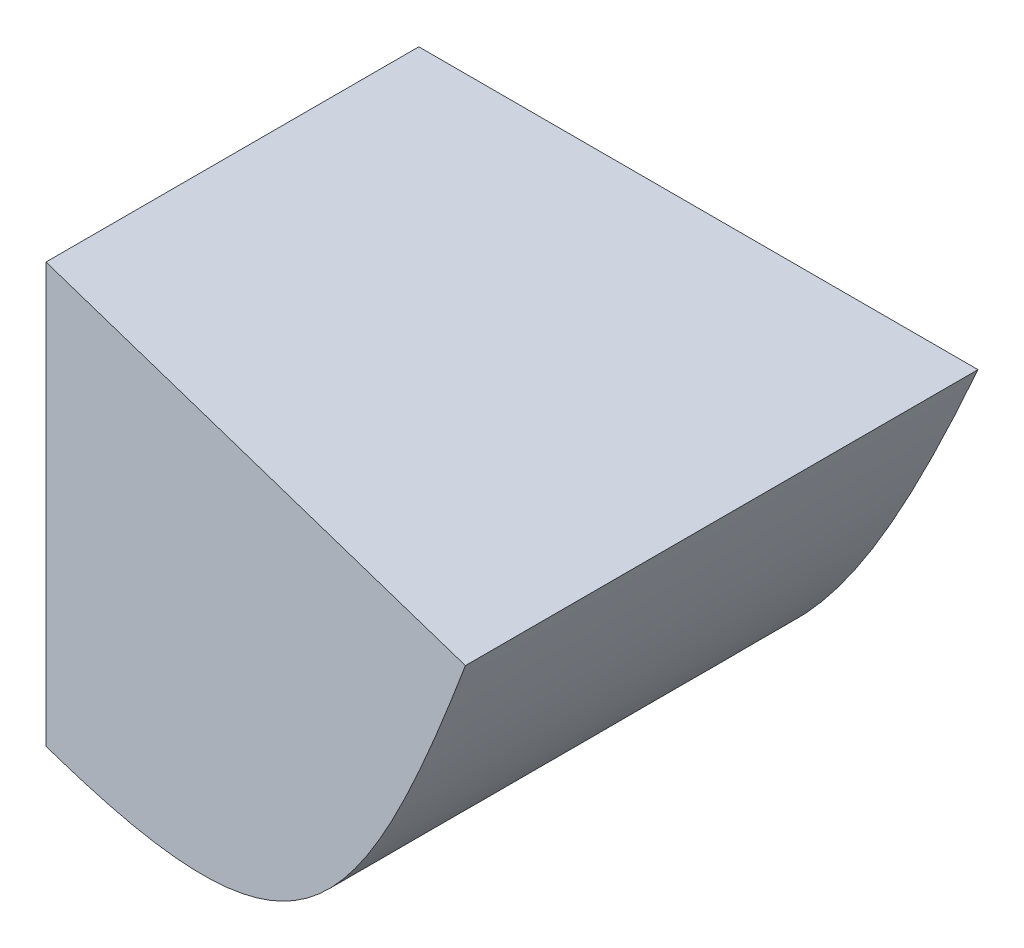
ISO-10303-21;
HEADER;
FILE_DESCRIPTION(('STEP AP214'),'2;1');
FILE_NAME('part.step','',(''),(''),'','','');
FILE_SCHEMA(('AUTOMOTIVE_DESIGN { 1 0 10303 214 1 1 1 1 }'));
ENDSEC;
DATA;
#1=APPLICATION_CONTEXT('core data for automotive mechanical design processes');
#2=APPLICATION_PROTOCOL_DEFINITION('international standard','automotive_design',2000,#1);
#3=PRODUCT_CONTEXT('',#1,'mechanical');
#4=PRODUCT('Part','Part','',(#3));
#5=PRODUCT_RELATED_PRODUCT_CATEGORY('part','',(#4));
#6=PRODUCT_DEFINITION_FORMATION('','',#4);
#7=PRODUCT_DEFINITION_CONTEXT('part definition',#1,'design');
#8=PRODUCT_DEFINITION('design','',#6,#7);
#9=PRODUCT_DEFINITION_SHAPE('','',#8);
#10=(LENGTH_UNIT() NAMED_UNIT(*) SI_UNIT(.MILLI.,.METRE.));
#11=(NAMED_UNIT(*) PLANE_ANGLE_UNIT() SI_UNIT($,.RADIAN.));
#12=(NAMED_UNIT(*) SI_UNIT($,.STERADIAN.) SOLID_ANGLE_UNIT());
#13=UNCERTAINTY_MEASURE_WITH_UNIT(LENGTH_MEASURE(1.E-05),#10,'distance_accuracy_value','');
#14=(GEOMETRIC_REPRESENTATION_CONTEXT(3) GLOBAL_UNCERTAINTY_ASSIGNED_CONTEXT((#13)) GLOBAL_UNIT_ASSIGNED_CONTEXT((#10,
#11,#12)) REPRESENTATION_CONTEXT('',''));
#15=CARTESIAN_POINT('',(0.,0.,0.));
#16=DIRECTION('',(0.,0.,1.));
#17=DIRECTION('',(1.,0.,0.));
#18=AXIS2_PLACEMENT_3D('',#15,#16,#17);
#19=CARTESIAN_POINT('',(0.,0.,14.));
#20=CARTESIAN_POINT('',(4.,0.,14.));
#21=CARTESIAN_POINT('',(8.,0.,14.));
#22=CARTESIAN_POINT('',(12.,9.,14.));
#23=(BOUNDED_CURVE() B_SPLINE_CURVE(3,(#19,#20,#21,#22),.UNSPECIFIED.,.F.,
.F.) B_SPLINE_CURVE_WITH_KNOTS((4,4),(0.,1.),
.UNSPECIFIED.) CURVE() GEOMETRIC_REPRESENTATION_ITEM() RATIONAL_B_SPLINE_CURVE((1.,0.75,1.25,1.)) REPRESENTATION_ITEM(''));
#24=DIRECTION('',(0.,0.,-1.));
#25=VECTOR('',#24,1.);
#26=SURFACE_OF_LINEAR_EXTRUSION('',#23,#25);
#27=CARTESIAN_POINT('',(0.,0.,8.));
#28=CARTESIAN_POINT('',(0.0894950185799589,-2.46426594112874E-05,8.02237375464499));
#29=CARTESIAN_POINT('',(0.178990921271722,3.44790598441509E-06,8.04474773031793));
#30=CARTESIAN_POINT('',(0.357984633659941,0.00040882602520247,8.08949615841499));
#31=CARTESIAN_POINT('',(0.447482443328439,0.000786124506047138,8.11187061083211));
#32=CARTESIAN_POINT('',(0.626563103188227,0.00213434804709195,8.15664077579706));
#33=CARTESIAN_POINT('',(0.716145949858039,0.00310586039431704,8.17903648746451));
#34=CARTESIAN_POINT('',(0.895300111680489,0.00579023877312327,8.22382502792012));
#35=CARTESIAN_POINT('',(0.984871426941575,0.00750309723162664,8.24621785673539));
#36=CARTESIAN_POINT('',(1.25361061586082,0.0139461207790217,8.3134026539652));
#37=CARTESIAN_POINT('',(1.43275223765388,0.0199804987456241,8.35818805941347));
#38=CARTESIAN_POINT('',(1.79578126045369,0.0365730822885767,8.44894531511342));
#39=CARTESIAN_POINT('',(1.97966366034832,0.0472511576820376,8.49491591508708));
#40=CARTESIAN_POINT('',(2.34702164067798,0.0739680960886774,8.58675541016949));
#41=CARTESIAN_POINT('',(2.53049731422365,0.0900055685734407,8.63262432855591));
#42=CARTESIAN_POINT('',(2.89684988533929,0.128314391351733,8.72421247133482));
#43=CARTESIAN_POINT('',(3.0797267670543,0.150585905382722,8.76993169176358));
#44=CARTESIAN_POINT('',(3.4458624243709,0.202511628105304,8.86146560609273));
#45=CARTESIAN_POINT('',(3.62911427989324,0.23221842747169,8.90727856997331));
#46=CARTESIAN_POINT('',(3.99418158871197,0.300023853383801,8.99854539717799));
#47=CARTESIAN_POINT('',(4.17599694411531,0.338123046822082,9.04399923602883));
#48=CARTESIAN_POINT('',(4.53755429325755,0.42390551333193,9.13438857331439));
#49=CARTESIAN_POINT('',(4.71729580557916,0.471590966218166,9.17932395139479));
#50=CARTESIAN_POINT('',(5.07157460599076,0.577100466588697,9.26789365149769));
#51=CARTESIAN_POINT('',(5.24614877020806,0.634791752675699,9.31153719255201));
#52=CARTESIAN_POINT('',(5.59127185340661,0.761777717630774,9.39781796335165));
#53=CARTESIAN_POINT('',(5.76182148921725,0.83107031205785,9.44045537230431));
#54=CARTESIAN_POINT('',(6.09760399512032,0.982061129361383,9.52440099878008));
#55=CARTESIAN_POINT('',(6.26283956528105,1.06375292756407,9.56570989132026));
#56=CARTESIAN_POINT('',(6.55627084946811,1.22332034162308,9.63906771236703));
#57=CARTESIAN_POINT('',(6.68558344388617,1.299019093545,9.67139586097154));
#58=CARTESIAN_POINT('',(6.93930308011034,1.45873580097647,9.73482577002758));
#59=CARTESIAN_POINT('',(7.06370967114373,1.54275451846125,9.76592741778593));
#60=CARTESIAN_POINT('',(7.30709884573898,1.71871118356034,9.82677471143474));
#61=CARTESIAN_POINT('',(7.42608230822959,1.81064784088158,9.8565205770574));
#62=CARTESIAN_POINT('',(7.65891802829605,2.00228348506358,9.91472950707401));
#63=CARTESIAN_POINT('',(7.77274357495324,2.10201688635951,9.94318589373831));
#64=CARTESIAN_POINT('',(7.99462847172668,2.30808769310849,9.99865711793167));
#65=CARTESIAN_POINT('',(8.10268719836608,2.41442580994866,10.0256717995915));
#66=CARTESIAN_POINT('',(8.31317775134355,2.63282089892605,10.0782944378359));
#67=CARTESIAN_POINT('',(8.41561000738277,2.74487743307565,10.1039025018457));
#68=CARTESIAN_POINT('',(8.6795312593708,3.04769794407112,10.1698828148427));
#69=CARTESIAN_POINT('',(8.83652258183024,3.24263252220874,10.2091306454576));
#70=CARTESIAN_POINT('',(9.13831606967315,3.64248141661565,10.2845790174183));
#71=CARTESIAN_POINT('',(9.28310517242649,3.8474060661937,10.3207762931066));
#72=CARTESIAN_POINT('',(9.56273411322651,4.26476954104626,10.3906835283066));
#73=CARTESIAN_POINT('',(9.69755795425074,4.47721967152352,10.4243894885627));
#74=CARTESIAN_POINT('',(9.95901473142613,4.9074483425959,10.4897536828565));
#75=CARTESIAN_POINT('',(10.0856454710491,5.12522829069651,10.5214113677623));
#76=CARTESIAN_POINT('',(10.3330379752425,5.56593249039473,10.5832594938106));
#77=CARTESIAN_POINT('',(10.4537623287519,5.78887893183055,10.613440582188));
#78=CARTESIAN_POINT('',(10.6897716016545,6.23743791036817,10.6724429004136));
#79=CARTESIAN_POINT('',(10.8050630946139,6.46304678975506,10.7012657736535));
#80=CARTESIAN_POINT('',(11.0313721099095,6.91639058215038,10.7578430274774));
#81=CARTESIAN_POINT('',(11.1423915844247,7.14412446353671,10.7855978961062));
#82=CARTESIAN_POINT('',(11.3610439800656,7.601323798563,10.8402609950164));
#83=CARTESIAN_POINT('',(11.468676725894,7.83078934107412,10.8671691814735));
#84=CARTESIAN_POINT('',(11.6110116085928,8.13907106648514,10.9027529021482));
#85=CARTESIAN_POINT('',(11.6469321507343,8.21729244140057,10.9117330376836));
#86=CARTESIAN_POINT('',(11.7184786971944,8.37388468377081,10.9296196742986));
#87=CARTESIAN_POINT('',(11.7541046816069,8.45225556089555,10.9385261704017));
#88=CARTESIAN_POINT('',(11.8602533007295,8.6868776964797,10.9650633251824));
#89=CARTESIAN_POINT('',(11.9303641335835,8.84332716029634,10.9825910333959));
#90=CARTESIAN_POINT('',(12.,9.,11.));
#91=B_SPLINE_CURVE_WITH_KNOTS('',3,(#27,#28,#29,#30,#31,#32,#33,#34,#35,#36,#37,#38,#39,#40,#41,
#42,#43,#44,#45,#46,#47,#48,#49,#50,#51,#52,#53,#54,#55,#56,#57,#58,#59,#60,#61,#62,#63,#64,#65,
#66,#67,#68,#69,#70,#71,#72,#73,#74,#75,#76,#77,#78,#79,#80,#81,#82,#83,#84,#85,#86,#87,#88,#89,
#90),.UNSPECIFIED.,.F.,.F.,(4,2,2,2,2,2,2,2,2,2,2,2,2,2,2,2,2,2,2,2,2,2,2,2,2,2,2,2,2,2,2,4),
(0.,0.276749499850494,0.553507659728632,0.830539794547899,1.10756909946578,1.66178692820915,
2.2312494565987,2.80056434901078,3.36989419591454,3.94337078160764,4.51688611659586,
5.09053201075625,5.65707935580553,6.22352501666203,6.7896781681998,7.24924749985058,
7.70885895966628,8.16839566324124,8.63008968248998,9.09183351685295,9.55354203804671,
10.3128938485303,11.0730484935667,11.8343980270247,12.5959508357505,13.3618282088139,
14.126753764015,14.891325517428,15.6559367802118,15.9155623489659,16.1752053220904,
16.6922037624957),.UNSPECIFIED.);
#92=CARTESIAN_POINT('',(0.,0.,8.));
#93=VERTEX_POINT('',#92);
#94=CARTESIAN_POINT('',(12.,9.,11.));
#95=VERTEX_POINT('',#94);
#96=EDGE_CURVE('E76',#93,#95,#91,.T.);
#97=ORIENTED_EDGE('',*,*,#96,.F.);
#98=DIRECTION('',(0.,0.,-1.));
#99=VECTOR('',#98,1.);
#100=CARTESIAN_POINT('',(0.,0.,14.));
#101=LINE('',#100,#99);
#102=CARTESIAN_POINT('',(0.,0.,0.));
#103=VERTEX_POINT('',#102);
#104=EDGE_CURVE('E64',#93,#103,#101,.T.);
#105=ORIENTED_EDGE('',*,*,#104,.T.);
#106=CARTESIAN_POINT('',(0.,0.,0.));
#107=CARTESIAN_POINT('',(4.,0.,0.));
#108=CARTESIAN_POINT('',(8.,0.,0.));
#109=CARTESIAN_POINT('',(12.,9.,0.));
#110=(BOUNDED_CURVE() B_SPLINE_CURVE(3,(#106,#107,#108,#109),.UNSPECIFIED.,.F.,
.F.) B_SPLINE_CURVE_WITH_KNOTS((4,4),(0.,1.),
.UNSPECIFIED.) CURVE() GEOMETRIC_REPRESENTATION_ITEM() RATIONAL_B_SPLINE_CURVE((1.,0.75,1.25,1.)) REPRESENTATION_ITEM(''));
#111=CARTESIAN_POINT('',(12.,9.,0.));
#112=VERTEX_POINT('',#111);
#113=EDGE_CURVE('E80',#103,#112,#110,.T.);
#114=ORIENTED_EDGE('',*,*,#113,.T.);
#115=DIRECTION('',(0.,0.,-1.));
#116=VECTOR('',#115,1.);
#117=CARTESIAN_POINT('',(12.,9.,14.));
#118=LINE('',#117,#116);
#119=EDGE_CURVE('E50',#95,#112,#118,.T.);
#120=ORIENTED_EDGE('',*,*,#119,.F.);
#121=EDGE_LOOP('',(#97,#105,#114,#120));
#122=FACE_BOUND('',#121,.T.);
#123=ADVANCED_FACE('F41',(#122),#26,.F.);
#124=CARTESIAN_POINT('',(12.,9.,14.));
#125=DIRECTION('',(0.,-1.,0.));
#126=DIRECTION('',(0.,0.,-1.));
#127=AXIS2_PLACEMENT_3D('',#124,#125,#126);
#128=PLANE('',#127);
#129=DIRECTION('',(-0.970142500145332,0.,-0.242535625036333));
#130=VECTOR('',#129,1.);
#131=CARTESIAN_POINT('',(12.7058823529412,9.,11.1764705882353));
#132=LINE('',#131,#130);
#133=CARTESIAN_POINT('',(0.,9.,8.));
#134=VERTEX_POINT('',#133);
#135=EDGE_CURVE('E56',#95,#134,#132,.T.);
#136=ORIENTED_EDGE('',*,*,#135,.F.);
#137=ORIENTED_EDGE('',*,*,#119,.T.);
#138=DIRECTION('',(-1.,0.,0.));
#139=VECTOR('',#138,1.);
#140=CARTESIAN_POINT('',(12.,9.,0.));
#141=LINE('',#140,#139);
#142=CARTESIAN_POINT('',(0.,9.,0.));
#143=VERTEX_POINT('',#142);
#144=EDGE_CURVE('E89',#112,#143,#141,.T.);
#145=ORIENTED_EDGE('',*,*,#144,.T.);
#146=DIRECTION('',(0.,0.,-1.));
#147=VECTOR('',#146,1.);
#148=CARTESIAN_POINT('',(0.,9.,14.));
#149=LINE('',#148,#147);
#150=EDGE_CURVE('E86',#134,#143,#149,.T.);
#151=ORIENTED_EDGE('',*,*,#150,.F.);
#152=EDGE_LOOP('',(#136,#137,#145,#151));
#153=FACE_BOUND('',#152,.T.);
#154=ADVANCED_FACE('F95',(#153),#128,.F.);
#155=CARTESIAN_POINT('',(0.,9.,14.));
#156=DIRECTION('',(1.,0.,0.));
#157=DIRECTION('',(0.,0.,-1.));
#158=AXIS2_PLACEMENT_3D('',#155,#156,#157);
#159=PLANE('',#158);
#160=DIRECTION('',(0.,-1.,0.));
#161=VECTOR('',#160,1.);
#162=CARTESIAN_POINT('',(0.,9.,8.));
#163=LINE('',#162,#161);
#164=EDGE_CURVE('E11',#134,#93,#163,.T.);
#165=ORIENTED_EDGE('',*,*,#164,.F.);
#166=ORIENTED_EDGE('',*,*,#150,.T.);
#167=DIRECTION('',(0.,-1.,0.));
#168=VECTOR('',#167,1.);
#169=CARTESIAN_POINT('',(0.,9.,0.));
#170=LINE('',#169,#168);
#171=EDGE_CURVE('E84',#143,#103,#170,.T.);
#172=ORIENTED_EDGE('',*,*,#171,.T.);
#173=ORIENTED_EDGE('',*,*,#104,.F.);
#174=EDGE_LOOP('',(#165,#166,#172,#173));
#175=FACE_BOUND('',#174,.T.);
#176=ADVANCED_FACE('F82',(#175),#159,.F.);
#177=CARTESIAN_POINT('',(6.375,1.125,0.));
#178=DIRECTION('',(0.,0.,-1.));
#179=DIRECTION('',(-1.,0.,0.));
#180=AXIS2_PLACEMENT_3D('',#177,#178,#179);
#181=PLANE('',#180);
#182=ORIENTED_EDGE('',*,*,#113,.F.);
#183=ORIENTED_EDGE('',*,*,#171,.F.);
#184=ORIENTED_EDGE('',*,*,#144,.F.);
#185=EDGE_LOOP('',(#182,#183,#184));
#186=FACE_BOUND('',#185,.T.);
#187=ADVANCED_FACE('F97',(#186),#181,.T.);
#188=CARTESIAN_POINT('',(-2.,0.,7.5));
#189=DIRECTION('',(-0.242535625036333,0.,0.970142500145332));
#190=DIRECTION('',(0.970142500145332,0.,0.242535625036333));
#191=AXIS2_PLACEMENT_3D('',#188,#189,#190);
#192=PLANE('',#191);
#193=ORIENTED_EDGE('',*,*,#96,.T.);
#194=ORIENTED_EDGE('',*,*,#135,.T.);
#195=ORIENTED_EDGE('',*,*,#164,.T.);
#196=EDGE_LOOP('',(#193,#194,#195));
#197=FACE_BOUND('',#196,.T.);
#198=ADVANCED_FACE('F75',(#197),#192,.T.);
#199=CLOSED_SHELL('',(#123,#154,#176,#187,#198));
#200=MANIFOLD_SOLID_BREP('B2',#199);
#201=ADVANCED_BREP_SHAPE_REPRESENTATION('',(#18,#200),#14);
#202=SHAPE_DEFINITION_REPRESENTATION(#9,#201);
ENDSEC;
END-ISO-10303-21;
